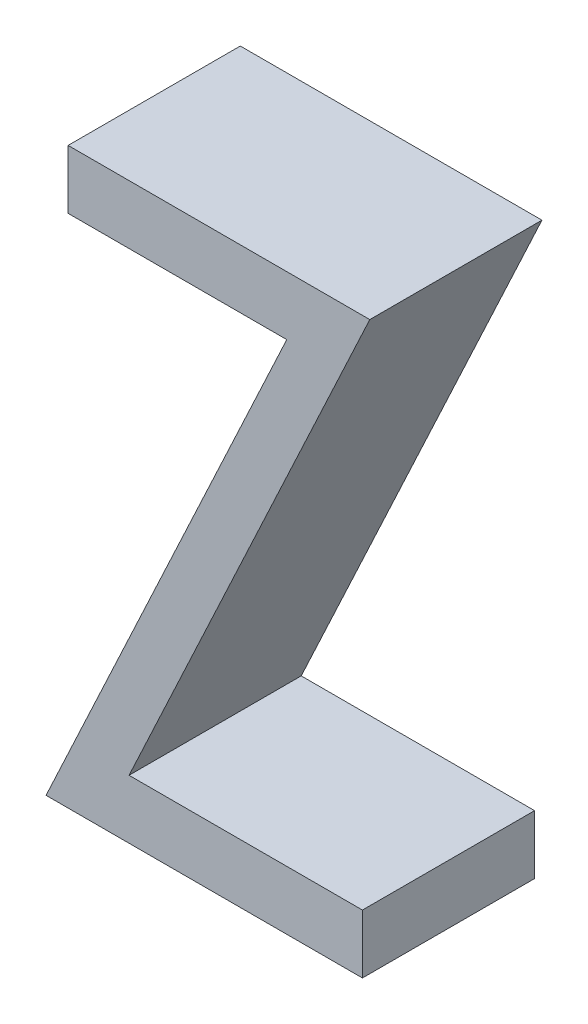
ISO-10303-21;
HEADER;
FILE_DESCRIPTION(('STEP AP214'),'2;1');
FILE_NAME('part.step','',(''),(''),'','','');
FILE_SCHEMA(('AUTOMOTIVE_DESIGN { 1 0 10303 214 1 1 1 1 }'));
ENDSEC;
DATA;
#1=APPLICATION_CONTEXT('core data for automotive mechanical design processes');
#2=APPLICATION_PROTOCOL_DEFINITION('international standard','automotive_design',2000,#1);
#3=PRODUCT_CONTEXT('',#1,'mechanical');
#4=PRODUCT('Part','Part','',(#3));
#5=PRODUCT_RELATED_PRODUCT_CATEGORY('part','',(#4));
#6=PRODUCT_DEFINITION_FORMATION('','',#4);
#7=PRODUCT_DEFINITION_CONTEXT('part definition',#1,'design');
#8=PRODUCT_DEFINITION('design','',#6,#7);
#9=PRODUCT_DEFINITION_SHAPE('','',#8);
#10=(LENGTH_UNIT() NAMED_UNIT(*) SI_UNIT(.MILLI.,.METRE.));
#11=(NAMED_UNIT(*) PLANE_ANGLE_UNIT() SI_UNIT($,.RADIAN.));
#12=(NAMED_UNIT(*) SI_UNIT($,.STERADIAN.) SOLID_ANGLE_UNIT());
#13=UNCERTAINTY_MEASURE_WITH_UNIT(LENGTH_MEASURE(1.E-05),#10,'distance_accuracy_value','');
#14=(GEOMETRIC_REPRESENTATION_CONTEXT(3) GLOBAL_UNCERTAINTY_ASSIGNED_CONTEXT((#13)) GLOBAL_UNIT_ASSIGNED_CONTEXT((#10,
#11,#12)) REPRESENTATION_CONTEXT('',''));
#15=CARTESIAN_POINT('',(0.,0.,0.));
#16=DIRECTION('',(0.,0.,1.));
#17=DIRECTION('',(1.,0.,0.));
#18=AXIS2_PLACEMENT_3D('',#15,#16,#17);
#19=CARTESIAN_POINT('',(-53.7877635849932,-18.3668292337473,1.5));
#20=DIRECTION('',(0.,-1.,0.));
#21=DIRECTION('',(0.,0.,-1.));
#22=AXIS2_PLACEMENT_3D('',#19,#20,#21);
#23=PLANE('',#22);
#24=DIRECTION('',(-1.,0.,0.));
#25=VECTOR('',#24,1.);
#26=CARTESIAN_POINT('',(-53.7877635849932,-18.3668292337473,0.));
#27=LINE('',#26,#25);
#28=CARTESIAN_POINT('',(-53.7877635849932,-18.3668292337473,0.));
#29=VERTEX_POINT('',#28);
#30=CARTESIAN_POINT('',(-55.6928116619162,-18.3668292337473,0.));
#31=VERTEX_POINT('',#30);
#32=EDGE_CURVE('E130',#29,#31,#27,.T.);
#33=ORIENTED_EDGE('',*,*,#32,.F.);
#34=DIRECTION('',(0.,0.,-1.));
#35=VECTOR('',#34,1.);
#36=CARTESIAN_POINT('',(-53.7877635849932,-18.3668292337473,1.5));
#37=LINE('',#36,#35);
#38=CARTESIAN_POINT('',(-53.7877635849932,-18.3668292337473,1.5));
#39=VERTEX_POINT('',#38);
#40=EDGE_CURVE('E11',#39,#29,#37,.T.);
#41=ORIENTED_EDGE('',*,*,#40,.F.);
#42=DIRECTION('',(-1.,0.,0.));
#43=VECTOR('',#42,1.);
#44=CARTESIAN_POINT('',(-53.7877635849932,-18.3668292337473,1.5));
#45=LINE('',#44,#43);
#46=CARTESIAN_POINT('',(-55.6928116619162,-18.3668292337473,1.5));
#47=VERTEX_POINT('',#46);
#48=EDGE_CURVE('E150',#39,#47,#45,.T.);
#49=ORIENTED_EDGE('',*,*,#48,.T.);
#50=DIRECTION('',(0.,0.,-1.));
#51=VECTOR('',#50,1.);
#52=CARTESIAN_POINT('',(-55.6928116619162,-18.3668292337473,1.5));
#53=LINE('',#52,#51);
#54=EDGE_CURVE('E36',#47,#31,#53,.T.);
#55=ORIENTED_EDGE('',*,*,#54,.T.);
#56=EDGE_LOOP('',(#33,#41,#49,#55));
#57=FACE_BOUND('',#56,.T.);
#58=ADVANCED_FACE('F33',(#57),#23,.T.);
#59=CARTESIAN_POINT('',(-55.8851193542239,-22.8540087209268,1.5));
#60=DIRECTION('',(-0.905924666699453,0.42343889555104,0.));
#61=DIRECTION('',(-0.42343889555104,-0.905924666699453,0.));
#62=AXIS2_PLACEMENT_3D('',#59,#60,#61);
#63=PLANE('',#62);
#64=DIRECTION('',(0.42343889555104,0.905924666699453,0.));
#65=VECTOR('',#64,1.);
#66=CARTESIAN_POINT('',(-55.8851193542239,-22.8540087209268,0.));
#67=LINE('',#66,#65);
#68=CARTESIAN_POINT('',(-55.8851193542239,-22.8540087209268,0.));
#69=VERTEX_POINT('',#68);
#70=EDGE_CURVE('E148',#69,#29,#67,.T.);
#71=ORIENTED_EDGE('',*,*,#70,.F.);
#72=DIRECTION('',(0.,0.,-1.));
#73=VECTOR('',#72,1.);
#74=CARTESIAN_POINT('',(-55.8851193542239,-22.8540087209268,1.5));
#75=LINE('',#74,#73);
#76=CARTESIAN_POINT('',(-55.8851193542239,-22.8540087209268,1.5));
#77=VERTEX_POINT('',#76);
#78=EDGE_CURVE('E42',#77,#69,#75,.T.);
#79=ORIENTED_EDGE('',*,*,#78,.F.);
#80=DIRECTION('',(0.42343889555104,0.905924666699453,0.));
#81=VECTOR('',#80,1.);
#82=CARTESIAN_POINT('',(-55.8851193542239,-22.8540087209268,1.5));
#83=LINE('',#82,#81);
#84=EDGE_CURVE('E120',#77,#39,#83,.T.);
#85=ORIENTED_EDGE('',*,*,#84,.T.);
#86=ORIENTED_EDGE('',*,*,#40,.T.);
#87=EDGE_LOOP('',(#71,#79,#85,#86));
#88=FACE_BOUND('',#87,.T.);
#89=ADVANCED_FACE('F162',(#88),#63,.T.);
#90=CARTESIAN_POINT('',(-53.1287090978137,-22.8540087209268,1.5));
#91=DIRECTION('',(0.,-1.,0.));
#92=DIRECTION('',(0.,0.,-1.));
#93=AXIS2_PLACEMENT_3D('',#90,#91,#92);
#94=PLANE('',#93);
#95=DIRECTION('',(-1.,0.,0.));
#96=VECTOR('',#95,1.);
#97=CARTESIAN_POINT('',(-53.1287090978137,-22.8540087209268,0.));
#98=LINE('',#97,#96);
#99=CARTESIAN_POINT('',(-53.1287090978137,-22.8540087209268,0.));
#100=VERTEX_POINT('',#99);
#101=EDGE_CURVE('E107',#100,#69,#98,.T.);
#102=ORIENTED_EDGE('',*,*,#101,.F.);
#103=DIRECTION('',(0.,0.,-1.));
#104=VECTOR('',#103,1.);
#105=CARTESIAN_POINT('',(-53.1287090978137,-22.8540087209268,1.5));
#106=LINE('',#105,#104);
#107=CARTESIAN_POINT('',(-53.1287090978137,-22.8540087209268,1.5));
#108=VERTEX_POINT('',#107);
#109=EDGE_CURVE('E102',#108,#100,#106,.T.);
#110=ORIENTED_EDGE('',*,*,#109,.F.);
#111=DIRECTION('',(-1.,0.,0.));
#112=VECTOR('',#111,1.);
#113=CARTESIAN_POINT('',(-53.1287090978137,-22.8540087209268,1.5));
#114=LINE('',#113,#112);
#115=EDGE_CURVE('E105',#108,#77,#114,.T.);
#116=ORIENTED_EDGE('',*,*,#115,.T.);
#117=ORIENTED_EDGE('',*,*,#78,.T.);
#118=EDGE_LOOP('',(#102,#110,#116,#117));
#119=FACE_BOUND('',#118,.T.);
#120=ADVANCED_FACE('F104',(#119),#94,.T.);
#121=CARTESIAN_POINT('',(-53.1287090978137,-22.3411882081063,1.5));
#122=DIRECTION('',(1.,0.,0.));
#123=DIRECTION('',(0.,0.,-1.));
#124=AXIS2_PLACEMENT_3D('',#121,#122,#123);
#125=PLANE('',#124);
#126=DIRECTION('',(0.,-1.,0.));
#127=VECTOR('',#126,1.);
#128=CARTESIAN_POINT('',(-53.1287090978137,-22.3411882081063,0.));
#129=LINE('',#128,#127);
#130=CARTESIAN_POINT('',(-53.1287090978137,-22.3411882081063,0.));
#131=VERTEX_POINT('',#130);
#132=EDGE_CURVE('E145',#131,#100,#129,.T.);
#133=ORIENTED_EDGE('',*,*,#132,.F.);
#134=DIRECTION('',(0.,0.,-1.));
#135=VECTOR('',#134,1.);
#136=CARTESIAN_POINT('',(-53.1287090978137,-22.3411882081063,1.5));
#137=LINE('',#136,#135);
#138=CARTESIAN_POINT('',(-53.1287090978137,-22.3411882081063,1.5));
#139=VERTEX_POINT('',#138);
#140=EDGE_CURVE('E112',#139,#131,#137,.T.);
#141=ORIENTED_EDGE('',*,*,#140,.F.);
#142=DIRECTION('',(0.,-1.,0.));
#143=VECTOR('',#142,1.);
#144=CARTESIAN_POINT('',(-53.1287090978137,-22.3411882081063,1.5));
#145=LINE('',#144,#143);
#146=EDGE_CURVE('E118',#139,#108,#145,.T.);
#147=ORIENTED_EDGE('',*,*,#146,.T.);
#148=ORIENTED_EDGE('',*,*,#109,.T.);
#149=EDGE_LOOP('',(#133,#141,#147,#148));
#150=FACE_BOUND('',#149,.T.);
#151=ADVANCED_FACE('F122',(#150),#125,.T.);
#152=CARTESIAN_POINT('',(-55.1619623029419,-22.3411882081063,1.5));
#153=DIRECTION('',(0.,1.,0.));
#154=DIRECTION('',(0.,0.,1.));
#155=AXIS2_PLACEMENT_3D('',#152,#153,#154);
#156=PLANE('',#155);
#157=DIRECTION('',(1.,0.,0.));
#158=VECTOR('',#157,1.);
#159=CARTESIAN_POINT('',(-55.1619623029419,-22.3411882081063,0.));
#160=LINE('',#159,#158);
#161=CARTESIAN_POINT('',(-55.1619623029419,-22.3411882081063,0.));
#162=VERTEX_POINT('',#161);
#163=EDGE_CURVE('E142',#162,#131,#160,.T.);
#164=ORIENTED_EDGE('',*,*,#163,.F.);
#165=DIRECTION('',(0.,0.,-1.));
#166=VECTOR('',#165,1.);
#167=CARTESIAN_POINT('',(-55.1619623029419,-22.3411882081063,1.5));
#168=LINE('',#167,#166);
#169=CARTESIAN_POINT('',(-55.1619623029419,-22.3411882081063,1.5));
#170=VERTEX_POINT('',#169);
#171=EDGE_CURVE('E154',#170,#162,#168,.T.);
#172=ORIENTED_EDGE('',*,*,#171,.F.);
#173=DIRECTION('',(1.,0.,0.));
#174=VECTOR('',#173,1.);
#175=CARTESIAN_POINT('',(-55.1619623029419,-22.3411882081063,1.5));
#176=LINE('',#175,#174);
#177=EDGE_CURVE('E123',#170,#139,#176,.T.);
#178=ORIENTED_EDGE('',*,*,#177,.T.);
#179=ORIENTED_EDGE('',*,*,#140,.T.);
#180=EDGE_LOOP('',(#164,#172,#178,#179));
#181=FACE_BOUND('',#180,.T.);
#182=ADVANCED_FACE('F175',(#181),#156,.T.);
#183=CARTESIAN_POINT('',(-53.0646065337111,-17.8540087209268,1.5));
#184=DIRECTION('',(0.905924666699453,-0.423438895551039,0.));
#185=DIRECTION('',(0.42343889555104,0.905924666699454,0.));
#186=AXIS2_PLACEMENT_3D('',#183,#184,#185);
#187=PLANE('',#186);
#188=DIRECTION('',(-0.42343889555104,-0.905924666699453,0.));
#189=VECTOR('',#188,1.);
#190=CARTESIAN_POINT('',(-53.0646065337111,-17.8540087209268,0.));
#191=LINE('',#190,#189);
#192=CARTESIAN_POINT('',(-53.0646065337111,-17.8540087209268,0.));
#193=VERTEX_POINT('',#192);
#194=EDGE_CURVE('E139',#193,#162,#191,.T.);
#195=ORIENTED_EDGE('',*,*,#194,.F.);
#196=DIRECTION('',(0.,0.,-1.));
#197=VECTOR('',#196,1.);
#198=CARTESIAN_POINT('',(-53.0646065337111,-17.8540087209268,1.5));
#199=LINE('',#198,#197);
#200=CARTESIAN_POINT('',(-53.0646065337111,-17.8540087209268,1.5));
#201=VERTEX_POINT('',#200);
#202=EDGE_CURVE('E156',#201,#193,#199,.T.);
#203=ORIENTED_EDGE('',*,*,#202,.F.);
#204=DIRECTION('',(-0.42343889555104,-0.905924666699453,0.));
#205=VECTOR('',#204,1.);
#206=CARTESIAN_POINT('',(-53.0646065337111,-17.8540087209268,1.5));
#207=LINE('',#206,#205);
#208=EDGE_CURVE('E125',#201,#170,#207,.T.);
#209=ORIENTED_EDGE('',*,*,#208,.T.);
#210=ORIENTED_EDGE('',*,*,#171,.T.);
#211=EDGE_LOOP('',(#195,#203,#209,#210));
#212=FACE_BOUND('',#211,.T.);
#213=ADVANCED_FACE('F178',(#212),#187,.T.);
#214=CARTESIAN_POINT('',(-55.6928116619162,-17.8540087209268,1.5));
#215=DIRECTION('',(0.,1.,0.));
#216=DIRECTION('',(0.,0.,1.));
#217=AXIS2_PLACEMENT_3D('',#214,#215,#216);
#218=PLANE('',#217);
#219=DIRECTION('',(1.,0.,0.));
#220=VECTOR('',#219,1.);
#221=CARTESIAN_POINT('',(-55.6928116619162,-17.8540087209268,0.));
#222=LINE('',#221,#220);
#223=CARTESIAN_POINT('',(-55.6928116619162,-17.8540087209268,0.));
#224=VERTEX_POINT('',#223);
#225=EDGE_CURVE('E136',#224,#193,#222,.T.);
#226=ORIENTED_EDGE('',*,*,#225,.F.);
#227=DIRECTION('',(0.,0.,-1.));
#228=VECTOR('',#227,1.);
#229=CARTESIAN_POINT('',(-55.6928116619162,-17.8540087209268,1.5));
#230=LINE('',#229,#228);
#231=CARTESIAN_POINT('',(-55.6928116619162,-17.8540087209268,1.5));
#232=VERTEX_POINT('',#231);
#233=EDGE_CURVE('E157',#232,#224,#230,.T.);
#234=ORIENTED_EDGE('',*,*,#233,.F.);
#235=DIRECTION('',(1.,0.,0.));
#236=VECTOR('',#235,1.);
#237=CARTESIAN_POINT('',(-55.6928116619162,-17.8540087209268,1.5));
#238=LINE('',#237,#236);
#239=EDGE_CURVE('E289',#232,#201,#238,.T.);
#240=ORIENTED_EDGE('',*,*,#239,.T.);
#241=ORIENTED_EDGE('',*,*,#202,.T.);
#242=EDGE_LOOP('',(#226,#234,#240,#241));
#243=FACE_BOUND('',#242,.T.);
#244=ADVANCED_FACE('F182',(#243),#218,.T.);
#245=CARTESIAN_POINT('',(-55.6928116619162,-18.3668292337473,1.5));
#246=DIRECTION('',(-1.,0.,0.));
#247=DIRECTION('',(0.,0.,1.));
#248=AXIS2_PLACEMENT_3D('',#245,#246,#247);
#249=PLANE('',#248);
#250=DIRECTION('',(0.,1.,0.));
#251=VECTOR('',#250,1.);
#252=CARTESIAN_POINT('',(-55.6928116619162,-18.3668292337473,0.));
#253=LINE('',#252,#251);
#254=EDGE_CURVE('E133',#31,#224,#253,.T.);
#255=ORIENTED_EDGE('',*,*,#254,.F.);
#256=ORIENTED_EDGE('',*,*,#54,.F.);
#257=DIRECTION('',(0.,1.,0.));
#258=VECTOR('',#257,1.);
#259=CARTESIAN_POINT('',(-55.6928116619162,-18.3668292337473,1.5));
#260=LINE('',#259,#258);
#261=EDGE_CURVE('E290',#47,#232,#260,.T.);
#262=ORIENTED_EDGE('',*,*,#261,.T.);
#263=ORIENTED_EDGE('',*,*,#233,.T.);
#264=EDGE_LOOP('',(#255,#256,#262,#263));
#265=FACE_BOUND('',#264,.T.);
#266=ADVANCED_FACE('F159',(#265),#249,.T.);
#267=CARTESIAN_POINT('',(0.,0.,1.5));
#268=DIRECTION('',(0.,0.,-1.));
#269=DIRECTION('',(-1.,0.,0.));
#270=AXIS2_PLACEMENT_3D('',#267,#268,#269);
#271=PLANE('',#270);
#272=ORIENTED_EDGE('',*,*,#48,.F.);
#273=ORIENTED_EDGE('',*,*,#84,.F.);
#274=ORIENTED_EDGE('',*,*,#115,.F.);
#275=ORIENTED_EDGE('',*,*,#146,.F.);
#276=ORIENTED_EDGE('',*,*,#177,.F.);
#277=ORIENTED_EDGE('',*,*,#208,.F.);
#278=ORIENTED_EDGE('',*,*,#239,.F.);
#279=ORIENTED_EDGE('',*,*,#261,.F.);
#280=EDGE_LOOP('',(#272,#273,#274,#275,#276,#277,#278,#279));
#281=FACE_BOUND('',#280,.T.);
#282=ADVANCED_FACE('F116',(#281),#271,.F.);
#283=CARTESIAN_POINT('',(0.,0.,0.));
#284=DIRECTION('',(0.,0.,-1.));
#285=DIRECTION('',(-1.,0.,0.));
#286=AXIS2_PLACEMENT_3D('',#283,#284,#285);
#287=PLANE('',#286);
#288=ORIENTED_EDGE('',*,*,#32,.T.);
#289=ORIENTED_EDGE('',*,*,#254,.T.);
#290=ORIENTED_EDGE('',*,*,#225,.T.);
#291=ORIENTED_EDGE('',*,*,#194,.T.);
#292=ORIENTED_EDGE('',*,*,#163,.T.);
#293=ORIENTED_EDGE('',*,*,#132,.T.);
#294=ORIENTED_EDGE('',*,*,#101,.T.);
#295=ORIENTED_EDGE('',*,*,#70,.T.);
#296=EDGE_LOOP('',(#288,#289,#290,#291,#292,#293,#294,#295));
#297=FACE_BOUND('',#296,.T.);
#298=ADVANCED_FACE('F161',(#297),#287,.T.);
#299=CLOSED_SHELL('',(#58,#89,#120,#151,#182,#213,#244,#266,#282,#298));
#300=MANIFOLD_SOLID_BREP('B2',#299);
#301=ADVANCED_BREP_SHAPE_REPRESENTATION('',(#18,#300),#14);
#302=SHAPE_DEFINITION_REPRESENTATION(#9,#301);
ENDSEC;
END-ISO-10303-21;
